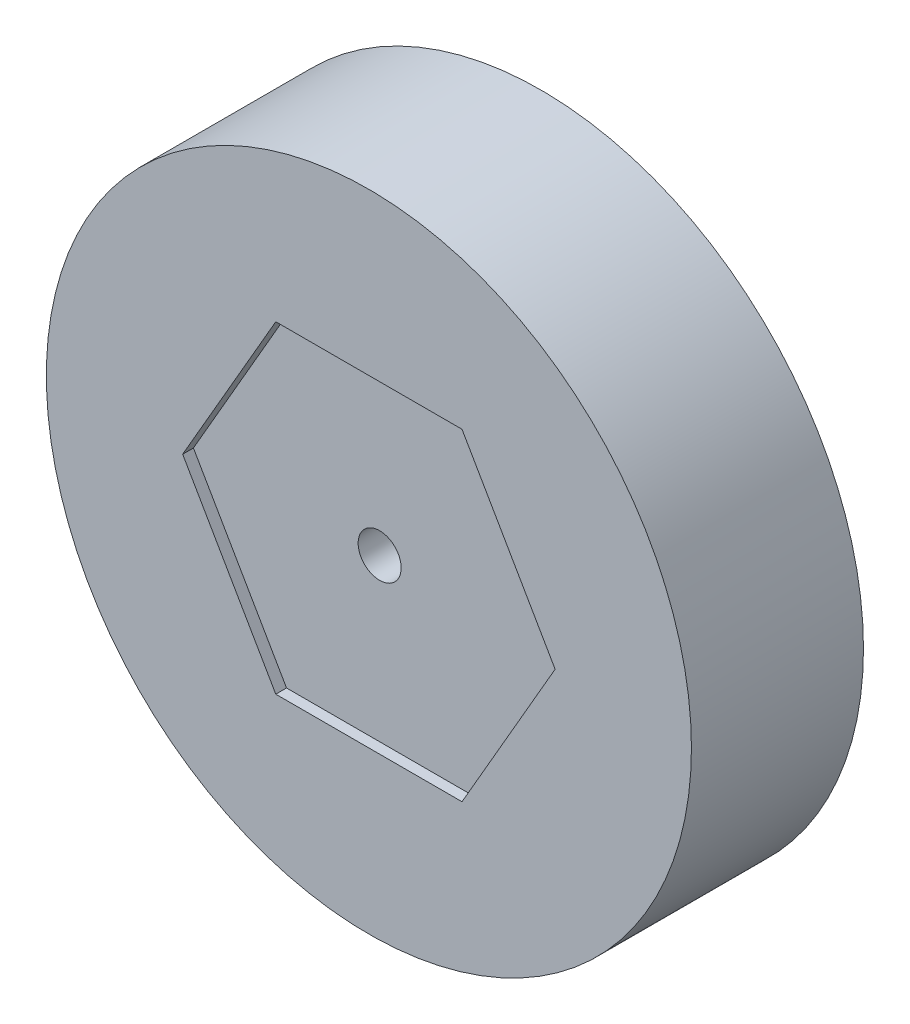
ISO-10303-21;
HEADER;
FILE_DESCRIPTION(('STEP AP214'),'2;1');
FILE_NAME('part.step','',(''),(''),'','','');
FILE_SCHEMA(('AUTOMOTIVE_DESIGN { 1 0 10303 214 1 1 1 1 }'));
ENDSEC;
DATA;
#1=APPLICATION_CONTEXT('core data for automotive mechanical design processes');
#2=APPLICATION_PROTOCOL_DEFINITION('international standard','automotive_design',2000,#1);
#3=PRODUCT_CONTEXT('',#1,'mechanical');
#4=PRODUCT('Part','Part','',(#3));
#5=PRODUCT_RELATED_PRODUCT_CATEGORY('part','',(#4));
#6=PRODUCT_DEFINITION_FORMATION('','',#4);
#7=PRODUCT_DEFINITION_CONTEXT('part definition',#1,'design');
#8=PRODUCT_DEFINITION('design','',#6,#7);
#9=PRODUCT_DEFINITION_SHAPE('','',#8);
#10=(LENGTH_UNIT() NAMED_UNIT(*) SI_UNIT(.MILLI.,.METRE.));
#11=(NAMED_UNIT(*) PLANE_ANGLE_UNIT() SI_UNIT($,.RADIAN.));
#12=(NAMED_UNIT(*) SI_UNIT($,.STERADIAN.) SOLID_ANGLE_UNIT());
#13=UNCERTAINTY_MEASURE_WITH_UNIT(LENGTH_MEASURE(1.E-05),#10,'distance_accuracy_value','');
#14=(GEOMETRIC_REPRESENTATION_CONTEXT(3) GLOBAL_UNCERTAINTY_ASSIGNED_CONTEXT((#13)) GLOBAL_UNIT_ASSIGNED_CONTEXT((#10,
#11,#12)) REPRESENTATION_CONTEXT('',''));
#15=CARTESIAN_POINT('',(0.,0.,0.));
#16=DIRECTION('',(0.,0.,1.));
#17=DIRECTION('',(1.,0.,0.));
#18=AXIS2_PLACEMENT_3D('',#15,#16,#17);
#19=CARTESIAN_POINT('',(0.,0.,4.));
#20=DIRECTION('',(0.,0.,-1.));
#21=DIRECTION('',(-1.,0.,0.));
#22=AXIS2_PLACEMENT_3D('',#19,#20,#21);
#23=CYLINDRICAL_SURFACE('',#22,1.);
#24=CARTESIAN_POINT('',(0.,0.,-4.));
#25=DIRECTION('',(0.,0.,1.));
#26=DIRECTION('',(1.,0.,0.));
#27=AXIS2_PLACEMENT_3D('',#24,#25,#26);
#28=CIRCLE('',#27,1.);
#29=CARTESIAN_POINT('',(1.,0.,-4.));
#30=VERTEX_POINT('',#29);
#31=EDGE_CURVE('E152',#30,#30,#28,.T.);
#32=ORIENTED_EDGE('',*,*,#31,.F.);
#33=EDGE_LOOP('',(#32));
#34=FACE_BOUND('',#33,.T.);
#35=CARTESIAN_POINT('',(0.,0.,3.5));
#36=DIRECTION('',(0.,0.,1.));
#37=DIRECTION('',(1.,0.,0.));
#38=AXIS2_PLACEMENT_3D('',#35,#36,#37);
#39=CIRCLE('',#38,1.);
#40=CARTESIAN_POINT('',(1.,0.,3.5));
#41=VERTEX_POINT('',#40);
#42=EDGE_CURVE('E47',#41,#41,#39,.T.);
#43=ORIENTED_EDGE('',*,*,#42,.T.);
#44=EDGE_LOOP('',(#43));
#45=FACE_BOUND('',#44,.T.);
#46=ADVANCED_FACE('F44',(#34,#45),#23,.F.);
#47=CARTESIAN_POINT('',(0.,0.,4.));
#48=DIRECTION('',(0.,0.,1.));
#49=DIRECTION('',(1.,0.,0.));
#50=AXIS2_PLACEMENT_3D('',#47,#48,#49);
#51=PLANE('',#50);
#52=DIRECTION('',(-1.,0.,0.));
#53=VECTOR('',#52,1.);
#54=CARTESIAN_POINT('',(4.3301270189222,7.5,4.));
#55=LINE('',#54,#53);
#56=CARTESIAN_POINT('',(4.3301270189222,7.5,4.));
#57=VERTEX_POINT('',#56);
#58=CARTESIAN_POINT('',(-4.33012701892219,7.5,4.));
#59=VERTEX_POINT('',#58);
#60=EDGE_CURVE('E65',#57,#59,#55,.T.);
#61=ORIENTED_EDGE('',*,*,#60,.F.);
#62=DIRECTION('',(-0.5,0.866025403784439,0.));
#63=VECTOR('',#62,1.);
#64=CARTESIAN_POINT('',(8.66025403784439,0.,4.));
#65=LINE('',#64,#63);
#66=CARTESIAN_POINT('',(8.66025403784439,0.,4.));
#67=VERTEX_POINT('',#66);
#68=EDGE_CURVE('E144',#67,#57,#65,.T.);
#69=ORIENTED_EDGE('',*,*,#68,.F.);
#70=DIRECTION('',(0.5,0.866025403784439,0.));
#71=VECTOR('',#70,1.);
#72=CARTESIAN_POINT('',(4.33012701892219,-7.5,4.));
#73=LINE('',#72,#71);
#74=CARTESIAN_POINT('',(4.33012701892219,-7.5,4.));
#75=VERTEX_POINT('',#74);
#76=EDGE_CURVE('E141',#75,#67,#73,.T.);
#77=ORIENTED_EDGE('',*,*,#76,.F.);
#78=DIRECTION('',(1.,0.,0.));
#79=VECTOR('',#78,1.);
#80=CARTESIAN_POINT('',(-4.33012701892219,-7.5,4.));
#81=LINE('',#80,#79);
#82=CARTESIAN_POINT('',(-4.33012701892219,-7.5,4.));
#83=VERTEX_POINT('',#82);
#84=EDGE_CURVE('E109',#83,#75,#81,.T.);
#85=ORIENTED_EDGE('',*,*,#84,.F.);
#86=DIRECTION('',(0.5,-0.866025403784439,0.));
#87=VECTOR('',#86,1.);
#88=CARTESIAN_POINT('',(-8.66025403784439,0.,4.));
#89=LINE('',#88,#87);
#90=CARTESIAN_POINT('',(-8.66025403784439,0.,4.));
#91=VERTEX_POINT('',#90);
#92=EDGE_CURVE('E137',#91,#83,#89,.T.);
#93=ORIENTED_EDGE('',*,*,#92,.F.);
#94=DIRECTION('',(-0.5,-0.866025403784439,0.));
#95=VECTOR('',#94,1.);
#96=CARTESIAN_POINT('',(-4.3301270189222,7.5,4.));
#97=LINE('',#96,#95);
#98=EDGE_CURVE('E136',#59,#91,#97,.T.);
#99=ORIENTED_EDGE('',*,*,#98,.F.);
#100=EDGE_LOOP('',(#61,#69,#77,#85,#93,#99));
#101=FACE_BOUND('',#100,.T.);
#102=CARTESIAN_POINT('',(0.,0.,4.));
#103=DIRECTION('',(0.,0.,1.));
#104=DIRECTION('',(1.,0.,0.));
#105=AXIS2_PLACEMENT_3D('',#102,#103,#104);
#106=CIRCLE('',#105,15.);
#107=CARTESIAN_POINT('',(15.,0.,4.));
#108=VERTEX_POINT('',#107);
#109=EDGE_CURVE('E11',#108,#108,#106,.T.);
#110=ORIENTED_EDGE('',*,*,#109,.T.);
#111=EDGE_LOOP('',(#110));
#112=FACE_BOUND('',#111,.T.);
#113=ADVANCED_FACE('F162',(#101,#112),#51,.T.);
#114=CARTESIAN_POINT('',(0.,0.,-4.));
#115=DIRECTION('',(0.,0.,1.));
#116=DIRECTION('',(1.,0.,0.));
#117=AXIS2_PLACEMENT_3D('',#114,#115,#116);
#118=PLANE('',#117);
#119=CARTESIAN_POINT('',(0.,0.,-4.));
#120=DIRECTION('',(0.,0.,1.));
#121=DIRECTION('',(1.,0.,0.));
#122=AXIS2_PLACEMENT_3D('',#119,#120,#121);
#123=CIRCLE('',#122,15.);
#124=CARTESIAN_POINT('',(15.,0.,-4.));
#125=VERTEX_POINT('',#124);
#126=EDGE_CURVE('E53',#125,#125,#123,.T.);
#127=ORIENTED_EDGE('',*,*,#126,.F.);
#128=EDGE_LOOP('',(#127));
#129=FACE_BOUND('',#128,.T.);
#130=ORIENTED_EDGE('',*,*,#31,.T.);
#131=EDGE_LOOP('',(#130));
#132=FACE_BOUND('',#131,.T.);
#133=ADVANCED_FACE('F159',(#129,#132),#118,.F.);
#134=CARTESIAN_POINT('',(0.,0.,4.));
#135=DIRECTION('',(0.,0.,-1.));
#136=DIRECTION('',(-1.,0.,0.));
#137=AXIS2_PLACEMENT_3D('',#134,#135,#136);
#138=CYLINDRICAL_SURFACE('',#137,15.);
#139=ORIENTED_EDGE('',*,*,#109,.F.);
#140=EDGE_LOOP('',(#139));
#141=FACE_BOUND('',#140,.T.);
#142=ORIENTED_EDGE('',*,*,#126,.T.);
#143=EDGE_LOOP('',(#142));
#144=FACE_BOUND('',#143,.T.);
#145=ADVANCED_FACE('F50',(#141,#144),#138,.T.);
#146=CARTESIAN_POINT('',(4.3301270189222,7.5,3.5));
#147=DIRECTION('',(0.,1.,0.));
#148=DIRECTION('',(-1.,0.,0.));
#149=AXIS2_PLACEMENT_3D('',#146,#147,#148);
#150=PLANE('',#149);
#151=ORIENTED_EDGE('',*,*,#60,.T.);
#152=DIRECTION('',(0.,0.,1.));
#153=VECTOR('',#152,1.);
#154=CARTESIAN_POINT('',(-4.3301270189222,7.5,3.5));
#155=LINE('',#154,#153);
#156=CARTESIAN_POINT('',(-4.3301270189222,7.5,3.5));
#157=VERTEX_POINT('',#156);
#158=EDGE_CURVE('E95',#157,#59,#155,.T.);
#159=ORIENTED_EDGE('',*,*,#158,.F.);
#160=DIRECTION('',(-1.,0.,0.));
#161=VECTOR('',#160,1.);
#162=CARTESIAN_POINT('',(4.3301270189222,7.5,3.5));
#163=LINE('',#162,#161);
#164=CARTESIAN_POINT('',(4.3301270189222,7.5,3.5));
#165=VERTEX_POINT('',#164);
#166=EDGE_CURVE('E150',#165,#157,#163,.T.);
#167=ORIENTED_EDGE('',*,*,#166,.F.);
#168=DIRECTION('',(0.,0.,1.));
#169=VECTOR('',#168,1.);
#170=CARTESIAN_POINT('',(4.3301270189222,7.5,3.5));
#171=LINE('',#170,#169);
#172=EDGE_CURVE('E69',#165,#57,#171,.T.);
#173=ORIENTED_EDGE('',*,*,#172,.T.);
#174=EDGE_LOOP('',(#151,#159,#167,#173));
#175=FACE_BOUND('',#174,.T.);
#176=ADVANCED_FACE('F183',(#175),#150,.F.);
#177=CARTESIAN_POINT('',(8.66025403784439,0.,3.5));
#178=DIRECTION('',(0.866025403784439,0.5,0.));
#179=DIRECTION('',(-0.5,0.866025403784439,0.));
#180=AXIS2_PLACEMENT_3D('',#177,#178,#179);
#181=PLANE('',#180);
#182=ORIENTED_EDGE('',*,*,#68,.T.);
#183=ORIENTED_EDGE('',*,*,#172,.F.);
#184=DIRECTION('',(-0.5,0.866025403784439,0.));
#185=VECTOR('',#184,1.);
#186=CARTESIAN_POINT('',(8.66025403784439,0.,3.5));
#187=LINE('',#186,#185);
#188=CARTESIAN_POINT('',(8.66025403784439,0.,3.5));
#189=VERTEX_POINT('',#188);
#190=EDGE_CURVE('E125',#189,#165,#187,.T.);
#191=ORIENTED_EDGE('',*,*,#190,.F.);
#192=DIRECTION('',(0.,0.,1.));
#193=VECTOR('',#192,1.);
#194=CARTESIAN_POINT('',(8.66025403784439,0.,3.5));
#195=LINE('',#194,#193);
#196=EDGE_CURVE('E111',#189,#67,#195,.T.);
#197=ORIENTED_EDGE('',*,*,#196,.T.);
#198=EDGE_LOOP('',(#182,#183,#191,#197));
#199=FACE_BOUND('',#198,.T.);
#200=ADVANCED_FACE('F185',(#199),#181,.F.);
#201=CARTESIAN_POINT('',(4.33012701892219,-7.5,3.5));
#202=DIRECTION('',(0.866025403784439,-0.5,0.));
#203=DIRECTION('',(0.5,0.866025403784439,0.));
#204=AXIS2_PLACEMENT_3D('',#201,#202,#203);
#205=PLANE('',#204);
#206=ORIENTED_EDGE('',*,*,#76,.T.);
#207=ORIENTED_EDGE('',*,*,#196,.F.);
#208=DIRECTION('',(0.5,0.866025403784439,0.));
#209=VECTOR('',#208,1.);
#210=CARTESIAN_POINT('',(4.33012701892219,-7.5,3.5));
#211=LINE('',#210,#209);
#212=CARTESIAN_POINT('',(4.33012701892219,-7.5,3.5));
#213=VERTEX_POINT('',#212);
#214=EDGE_CURVE('E119',#213,#189,#211,.T.);
#215=ORIENTED_EDGE('',*,*,#214,.F.);
#216=DIRECTION('',(0.,0.,1.));
#217=VECTOR('',#216,1.);
#218=CARTESIAN_POINT('',(4.33012701892219,-7.5,3.5));
#219=LINE('',#218,#217);
#220=EDGE_CURVE('E103',#213,#75,#219,.T.);
#221=ORIENTED_EDGE('',*,*,#220,.T.);
#222=EDGE_LOOP('',(#206,#207,#215,#221));
#223=FACE_BOUND('',#222,.T.);
#224=ADVANCED_FACE('F116',(#223),#205,.F.);
#225=CARTESIAN_POINT('',(-4.33012701892219,-7.5,3.5));
#226=DIRECTION('',(0.,-1.,0.));
#227=DIRECTION('',(0.,0.,-1.));
#228=AXIS2_PLACEMENT_3D('',#225,#226,#227);
#229=PLANE('',#228);
#230=ORIENTED_EDGE('',*,*,#84,.T.);
#231=ORIENTED_EDGE('',*,*,#220,.F.);
#232=DIRECTION('',(1.,0.,0.));
#233=VECTOR('',#232,1.);
#234=CARTESIAN_POINT('',(-4.33012701892219,-7.5,3.5));
#235=LINE('',#234,#233);
#236=CARTESIAN_POINT('',(-4.33012701892219,-7.5,3.5));
#237=VERTEX_POINT('',#236);
#238=EDGE_CURVE('E110',#237,#213,#235,.T.);
#239=ORIENTED_EDGE('',*,*,#238,.F.);
#240=DIRECTION('',(0.,0.,1.));
#241=VECTOR('',#240,1.);
#242=CARTESIAN_POINT('',(-4.33012701892219,-7.5,3.5));
#243=LINE('',#242,#241);
#244=EDGE_CURVE('E113',#237,#83,#243,.T.);
#245=ORIENTED_EDGE('',*,*,#244,.T.);
#246=EDGE_LOOP('',(#230,#231,#239,#245));
#247=FACE_BOUND('',#246,.T.);
#248=ADVANCED_FACE('F104',(#247),#229,.F.);
#249=CARTESIAN_POINT('',(-8.66025403784439,0.,3.5));
#250=DIRECTION('',(-0.866025403784439,-0.5,0.));
#251=DIRECTION('',(0.5,-0.866025403784439,0.));
#252=AXIS2_PLACEMENT_3D('',#249,#250,#251);
#253=PLANE('',#252);
#254=ORIENTED_EDGE('',*,*,#92,.T.);
#255=ORIENTED_EDGE('',*,*,#244,.F.);
#256=DIRECTION('',(0.5,-0.866025403784439,0.));
#257=VECTOR('',#256,1.);
#258=CARTESIAN_POINT('',(-8.66025403784439,0.,3.5));
#259=LINE('',#258,#257);
#260=CARTESIAN_POINT('',(-8.66025403784439,0.,3.5));
#261=VERTEX_POINT('',#260);
#262=EDGE_CURVE('E126',#261,#237,#259,.T.);
#263=ORIENTED_EDGE('',*,*,#262,.F.);
#264=DIRECTION('',(0.,0.,1.));
#265=VECTOR('',#264,1.);
#266=CARTESIAN_POINT('',(-8.66025403784439,0.,3.5));
#267=LINE('',#266,#265);
#268=EDGE_CURVE('E151',#261,#91,#267,.T.);
#269=ORIENTED_EDGE('',*,*,#268,.T.);
#270=EDGE_LOOP('',(#254,#255,#263,#269));
#271=FACE_BOUND('',#270,.T.);
#272=ADVANCED_FACE('F178',(#271),#253,.F.);
#273=CARTESIAN_POINT('',(-4.3301270189222,7.5,3.5));
#274=DIRECTION('',(-0.866025403784439,0.5,0.));
#275=DIRECTION('',(-0.5,-0.866025403784439,0.));
#276=AXIS2_PLACEMENT_3D('',#273,#274,#275);
#277=PLANE('',#276);
#278=ORIENTED_EDGE('',*,*,#98,.T.);
#279=ORIENTED_EDGE('',*,*,#268,.F.);
#280=DIRECTION('',(-0.5,-0.866025403784439,0.));
#281=VECTOR('',#280,1.);
#282=CARTESIAN_POINT('',(-4.3301270189222,7.5,3.5));
#283=LINE('',#282,#281);
#284=EDGE_CURVE('E128',#157,#261,#283,.T.);
#285=ORIENTED_EDGE('',*,*,#284,.F.);
#286=ORIENTED_EDGE('',*,*,#158,.T.);
#287=EDGE_LOOP('',(#278,#279,#285,#286));
#288=FACE_BOUND('',#287,.T.);
#289=ADVANCED_FACE('F174',(#288),#277,.F.);
#290=CARTESIAN_POINT('',(0.,0.,3.5));
#291=DIRECTION('',(0.,0.,1.));
#292=DIRECTION('',(1.,0.,0.));
#293=AXIS2_PLACEMENT_3D('',#290,#291,#292);
#294=PLANE('',#293);
#295=ORIENTED_EDGE('',*,*,#42,.F.);
#296=EDGE_LOOP('',(#295));
#297=FACE_BOUND('',#296,.T.);
#298=ORIENTED_EDGE('',*,*,#166,.T.);
#299=ORIENTED_EDGE('',*,*,#284,.T.);
#300=ORIENTED_EDGE('',*,*,#262,.T.);
#301=ORIENTED_EDGE('',*,*,#238,.T.);
#302=ORIENTED_EDGE('',*,*,#214,.T.);
#303=ORIENTED_EDGE('',*,*,#190,.T.);
#304=EDGE_LOOP('',(#298,#299,#300,#301,#302,#303));
#305=FACE_BOUND('',#304,.T.);
#306=ADVANCED_FACE('F124',(#297,#305),#294,.T.);
#307=CLOSED_SHELL('',(#46,#113,#133,#145,#176,#200,#224,#248,#272,#289,#306));
#308=MANIFOLD_SOLID_BREP('B2',#307);
#309=ADVANCED_BREP_SHAPE_REPRESENTATION('',(#18,#308),#14);
#310=SHAPE_DEFINITION_REPRESENTATION(#9,#309);
ENDSEC;
END-ISO-10303-21;
